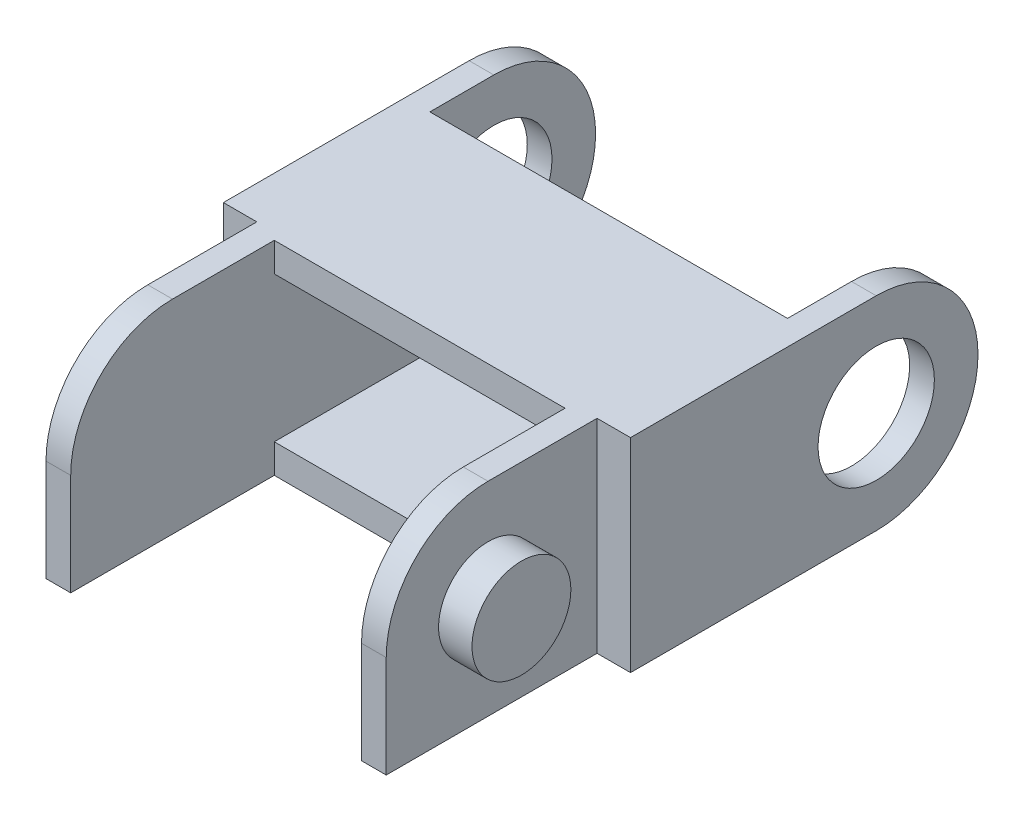
ISO-10303-21;
HEADER;
FILE_DESCRIPTION(('STEP AP214'),'2;1');
FILE_NAME('part.step','',(''),(''),'','','');
FILE_SCHEMA(('AUTOMOTIVE_DESIGN { 1 0 10303 214 1 1 1 1 }'));
ENDSEC;
DATA;
#1=APPLICATION_CONTEXT('core data for automotive mechanical design processes');
#2=APPLICATION_PROTOCOL_DEFINITION('international standard','automotive_design',2000,#1);
#3=PRODUCT_CONTEXT('',#1,'mechanical');
#4=PRODUCT('Part','Part','',(#3));
#5=PRODUCT_RELATED_PRODUCT_CATEGORY('part','',(#4));
#6=PRODUCT_DEFINITION_FORMATION('','',#4);
#7=PRODUCT_DEFINITION_CONTEXT('part definition',#1,'design');
#8=PRODUCT_DEFINITION('design','',#6,#7);
#9=PRODUCT_DEFINITION_SHAPE('','',#8);
#10=(LENGTH_UNIT() NAMED_UNIT(*) SI_UNIT(.MILLI.,.METRE.));
#11=(NAMED_UNIT(*) PLANE_ANGLE_UNIT() SI_UNIT($,.RADIAN.));
#12=(NAMED_UNIT(*) SI_UNIT($,.STERADIAN.) SOLID_ANGLE_UNIT());
#13=UNCERTAINTY_MEASURE_WITH_UNIT(LENGTH_MEASURE(1.E-05),#10,'distance_accuracy_value','');
#14=(GEOMETRIC_REPRESENTATION_CONTEXT(3) GLOBAL_UNCERTAINTY_ASSIGNED_CONTEXT((#13)) GLOBAL_UNIT_ASSIGNED_CONTEXT((#10,
#11,#12)) REPRESENTATION_CONTEXT('',''));
#15=CARTESIAN_POINT('',(0.,0.,0.));
#16=DIRECTION('',(0.,0.,1.));
#17=DIRECTION('',(1.,0.,0.));
#18=AXIS2_PLACEMENT_3D('',#15,#16,#17);
#19=CARTESIAN_POINT('',(-12.,-7.,5.));
#20=DIRECTION('',(0.,1.,0.));
#21=DIRECTION('',(-1.,0.,0.));
#22=AXIS2_PLACEMENT_3D('',#19,#20,#21);
#23=PLANE('',#22);
#24=DIRECTION('',(-1.,0.,0.));
#25=VECTOR('',#24,1.);
#26=CARTESIAN_POINT('',(25.7089257261219,-7.,4.5));
#27=LINE('',#26,#25);
#28=CARTESIAN_POINT('',(-11.7,-7.,4.5));
#29=VERTEX_POINT('',#28);
#30=CARTESIAN_POINT('',(-14.,-7.,4.5));
#31=VERTEX_POINT('',#30);
#32=EDGE_CURVE('E243',#29,#31,#27,.T.);
#33=ORIENTED_EDGE('',*,*,#32,.T.);
#34=DIRECTION('',(0.,0.,-1.));
#35=VECTOR('',#34,1.);
#36=CARTESIAN_POINT('',(-14.,-7.,5.));
#37=LINE('',#36,#35);
#38=CARTESIAN_POINT('',(-14.,-7.,-12.4));
#39=VERTEX_POINT('',#38);
#40=EDGE_CURVE('E292',#31,#39,#37,.T.);
#41=ORIENTED_EDGE('',*,*,#40,.T.);
#42=DIRECTION('',(1.,0.,0.));
#43=VECTOR('',#42,1.);
#44=CARTESIAN_POINT('',(-14.,-7.,-12.4));
#45=LINE('',#44,#43);
#46=CARTESIAN_POINT('',(-12.3,-7.,-12.4));
#47=VERTEX_POINT('',#46);
#48=EDGE_CURVE('E302',#39,#47,#45,.T.);
#49=ORIENTED_EDGE('',*,*,#48,.T.);
#50=DIRECTION('',(0.,0.,1.));
#51=VECTOR('',#50,1.);
#52=CARTESIAN_POINT('',(-12.3,-7.,-12.4));
#53=LINE('',#52,#51);
#54=CARTESIAN_POINT('',(-12.3,-7.,-5.));
#55=VERTEX_POINT('',#54);
#56=EDGE_CURVE('E257',#47,#55,#53,.T.);
#57=ORIENTED_EDGE('',*,*,#56,.T.);
#58=DIRECTION('',(1.,0.,0.));
#59=VECTOR('',#58,1.);
#60=CARTESIAN_POINT('',(-12.,-7.,-5.));
#61=LINE('',#60,#59);
#62=CARTESIAN_POINT('',(12.3,-7.,-5.));
#63=VERTEX_POINT('',#62);
#64=EDGE_CURVE('E468',#55,#63,#61,.T.);
#65=ORIENTED_EDGE('',*,*,#64,.T.);
#66=DIRECTION('',(0.,0.,1.));
#67=VECTOR('',#66,1.);
#68=CARTESIAN_POINT('',(12.3,-7.,-12.4));
#69=LINE('',#68,#67);
#70=CARTESIAN_POINT('',(12.3,-7.,-12.4));
#71=VERTEX_POINT('',#70);
#72=EDGE_CURVE('E355',#71,#63,#69,.T.);
#73=ORIENTED_EDGE('',*,*,#72,.F.);
#74=DIRECTION('',(-1.,0.,0.));
#75=VECTOR('',#74,1.);
#76=CARTESIAN_POINT('',(14.,-7.,-12.4));
#77=LINE('',#76,#75);
#78=CARTESIAN_POINT('',(14.,-7.,-12.4));
#79=VERTEX_POINT('',#78);
#80=EDGE_CURVE('E397',#79,#71,#77,.T.);
#81=ORIENTED_EDGE('',*,*,#80,.F.);
#82=DIRECTION('',(0.,0.,-1.));
#83=VECTOR('',#82,1.);
#84=CARTESIAN_POINT('',(14.,-7.,5.));
#85=LINE('',#84,#83);
#86=CARTESIAN_POINT('',(14.,-7.,4.5));
#87=VERTEX_POINT('',#86);
#88=EDGE_CURVE('E394',#87,#79,#85,.T.);
#89=ORIENTED_EDGE('',*,*,#88,.F.);
#90=DIRECTION('',(1.,0.,0.));
#91=VECTOR('',#90,1.);
#92=CARTESIAN_POINT('',(-2.3089257261219,-7.,4.5));
#93=LINE('',#92,#91);
#94=CARTESIAN_POINT('',(11.7,-7.,4.5));
#95=VERTEX_POINT('',#94);
#96=EDGE_CURVE('E343',#95,#87,#93,.T.);
#97=ORIENTED_EDGE('',*,*,#96,.F.);
#98=DIRECTION('',(0.,0.,-1.));
#99=VECTOR('',#98,1.);
#100=CARTESIAN_POINT('',(11.7,-7.,19.));
#101=LINE('',#100,#99);
#102=CARTESIAN_POINT('',(11.7,-7.,19.));
#103=VERTEX_POINT('',#102);
#104=EDGE_CURVE('E366',#103,#95,#101,.T.);
#105=ORIENTED_EDGE('',*,*,#104,.F.);
#106=DIRECTION('',(1.,0.,0.));
#107=VECTOR('',#106,1.);
#108=CARTESIAN_POINT('',(10.,-7.,19.));
#109=LINE('',#108,#107);
#110=CARTESIAN_POINT('',(10.,-7.,19.));
#111=VERTEX_POINT('',#110);
#112=EDGE_CURVE('E425',#111,#103,#109,.T.);
#113=ORIENTED_EDGE('',*,*,#112,.F.);
#114=DIRECTION('',(0.,0.,-1.));
#115=VECTOR('',#114,1.);
#116=CARTESIAN_POINT('',(10.,-7.,5.));
#117=LINE('',#116,#115);
#118=CARTESIAN_POINT('',(10.,-7.,5.));
#119=VERTEX_POINT('',#118);
#120=EDGE_CURVE('E404',#111,#119,#117,.T.);
#121=ORIENTED_EDGE('',*,*,#120,.T.);
#122=DIRECTION('',(1.,0.,0.));
#123=VECTOR('',#122,1.);
#124=CARTESIAN_POINT('',(-12.,-7.,5.));
#125=LINE('',#124,#123);
#126=CARTESIAN_POINT('',(-10.,-7.,5.));
#127=VERTEX_POINT('',#126);
#128=EDGE_CURVE('E469',#127,#119,#125,.T.);
#129=ORIENTED_EDGE('',*,*,#128,.F.);
#130=DIRECTION('',(0.,0.,-1.));
#131=VECTOR('',#130,1.);
#132=CARTESIAN_POINT('',(-10.,-7.,5.));
#133=LINE('',#132,#131);
#134=CARTESIAN_POINT('',(-10.,-7.,19.));
#135=VERTEX_POINT('',#134);
#136=EDGE_CURVE('E306',#135,#127,#133,.T.);
#137=ORIENTED_EDGE('',*,*,#136,.F.);
#138=DIRECTION('',(-1.,0.,0.));
#139=VECTOR('',#138,1.);
#140=CARTESIAN_POINT('',(-10.,-7.,19.));
#141=LINE('',#140,#139);
#142=CARTESIAN_POINT('',(-11.7,-7.,19.));
#143=VERTEX_POINT('',#142);
#144=EDGE_CURVE('E322',#135,#143,#141,.T.);
#145=ORIENTED_EDGE('',*,*,#144,.T.);
#146=DIRECTION('',(0.,0.,-1.));
#147=VECTOR('',#146,1.);
#148=CARTESIAN_POINT('',(-11.7,-7.,19.));
#149=LINE('',#148,#147);
#150=EDGE_CURVE('E265',#143,#29,#149,.T.);
#151=ORIENTED_EDGE('',*,*,#150,.T.);
#152=EDGE_LOOP('',(#33,#41,#49,#57,#65,#73,#81,#89,#97,#105,#113,#121,#129,#137,#145,#151));
#153=FACE_BOUND('',#152,.T.);
#154=ADVANCED_FACE('F39',(#153),#23,.F.);
#155=CARTESIAN_POINT('',(-12.,7.,5.));
#156=DIRECTION('',(0.,-1.,0.));
#157=DIRECTION('',(0.,0.,-1.));
#158=AXIS2_PLACEMENT_3D('',#155,#156,#157);
#159=PLANE('',#158);
#160=DIRECTION('',(0.,0.,-1.));
#161=VECTOR('',#160,1.);
#162=CARTESIAN_POINT('',(12.3,7.,-5.));
#163=LINE('',#162,#161);
#164=CARTESIAN_POINT('',(12.3,7.,-8.));
#165=VERTEX_POINT('',#164);
#166=CARTESIAN_POINT('',(12.3,7.,-12.4));
#167=VERTEX_POINT('',#166);
#168=EDGE_CURVE('E230',#165,#167,#163,.T.);
#169=ORIENTED_EDGE('',*,*,#168,.F.);
#170=DIRECTION('',(-1.,0.,0.));
#171=VECTOR('',#170,1.);
#172=CARTESIAN_POINT('',(-12.3,7.,-8.));
#173=LINE('',#172,#171);
#174=CARTESIAN_POINT('',(-12.3,7.,-8.));
#175=VERTEX_POINT('',#174);
#176=EDGE_CURVE('E207',#165,#175,#173,.T.);
#177=ORIENTED_EDGE('',*,*,#176,.T.);
#178=DIRECTION('',(0.,0.,-1.));
#179=VECTOR('',#178,1.);
#180=CARTESIAN_POINT('',(-12.3,7.,-5.));
#181=LINE('',#180,#179);
#182=CARTESIAN_POINT('',(-12.3,7.,-12.4));
#183=VERTEX_POINT('',#182);
#184=EDGE_CURVE('E217',#175,#183,#181,.T.);
#185=ORIENTED_EDGE('',*,*,#184,.T.);
#186=DIRECTION('',(1.,0.,0.));
#187=VECTOR('',#186,1.);
#188=CARTESIAN_POINT('',(-14.,7.,-12.4));
#189=LINE('',#188,#187);
#190=CARTESIAN_POINT('',(-14.,7.,-12.4));
#191=VERTEX_POINT('',#190);
#192=EDGE_CURVE('E299',#191,#183,#189,.T.);
#193=ORIENTED_EDGE('',*,*,#192,.F.);
#194=DIRECTION('',(0.,0.,1.));
#195=VECTOR('',#194,1.);
#196=CARTESIAN_POINT('',(-14.,7.,-12.4));
#197=LINE('',#196,#195);
#198=CARTESIAN_POINT('',(-14.,7.,4.5));
#199=VERTEX_POINT('',#198);
#200=EDGE_CURVE('E295',#191,#199,#197,.T.);
#201=ORIENTED_EDGE('',*,*,#200,.T.);
#202=DIRECTION('',(-1.,0.,0.));
#203=VECTOR('',#202,1.);
#204=CARTESIAN_POINT('',(25.7089257261219,7.,4.5));
#205=LINE('',#204,#203);
#206=CARTESIAN_POINT('',(-11.7,7.,4.5));
#207=VERTEX_POINT('',#206);
#208=EDGE_CURVE('E236',#207,#199,#205,.T.);
#209=ORIENTED_EDGE('',*,*,#208,.F.);
#210=DIRECTION('',(0.,0.,1.));
#211=VECTOR('',#210,1.);
#212=CARTESIAN_POINT('',(-11.7,7.,5.));
#213=LINE('',#212,#211);
#214=CARTESIAN_POINT('',(-11.7,7.,12.));
#215=VERTEX_POINT('',#214);
#216=EDGE_CURVE('E276',#207,#215,#213,.T.);
#217=ORIENTED_EDGE('',*,*,#216,.T.);
#218=DIRECTION('',(-1.,0.,0.));
#219=VECTOR('',#218,1.);
#220=CARTESIAN_POINT('',(-10.,7.,12.));
#221=LINE('',#220,#219);
#222=CARTESIAN_POINT('',(-10.,7.,12.));
#223=VERTEX_POINT('',#222);
#224=EDGE_CURVE('E323',#223,#215,#221,.T.);
#225=ORIENTED_EDGE('',*,*,#224,.F.);
#226=DIRECTION('',(0.,0.,1.));
#227=VECTOR('',#226,1.);
#228=CARTESIAN_POINT('',(-10.,7.,12.));
#229=LINE('',#228,#227);
#230=CARTESIAN_POINT('',(-10.,7.,5.));
#231=VERTEX_POINT('',#230);
#232=EDGE_CURVE('E315',#231,#223,#229,.T.);
#233=ORIENTED_EDGE('',*,*,#232,.F.);
#234=DIRECTION('',(-1.,0.,0.));
#235=VECTOR('',#234,1.);
#236=CARTESIAN_POINT('',(-12.,7.,5.));
#237=LINE('',#236,#235);
#238=CARTESIAN_POINT('',(10.,7.,5.));
#239=VERTEX_POINT('',#238);
#240=EDGE_CURVE('E472',#239,#231,#237,.T.);
#241=ORIENTED_EDGE('',*,*,#240,.F.);
#242=DIRECTION('',(0.,0.,1.));
#243=VECTOR('',#242,1.);
#244=CARTESIAN_POINT('',(10.,7.,12.));
#245=LINE('',#244,#243);
#246=CARTESIAN_POINT('',(10.,7.,12.));
#247=VERTEX_POINT('',#246);
#248=EDGE_CURVE('E411',#239,#247,#245,.T.);
#249=ORIENTED_EDGE('',*,*,#248,.T.);
#250=DIRECTION('',(1.,0.,0.));
#251=VECTOR('',#250,1.);
#252=CARTESIAN_POINT('',(10.,7.,12.));
#253=LINE('',#252,#251);
#254=CARTESIAN_POINT('',(11.7,7.,12.));
#255=VERTEX_POINT('',#254);
#256=EDGE_CURVE('E424',#247,#255,#253,.T.);
#257=ORIENTED_EDGE('',*,*,#256,.T.);
#258=DIRECTION('',(0.,0.,1.));
#259=VECTOR('',#258,1.);
#260=CARTESIAN_POINT('',(11.7,7.,5.));
#261=LINE('',#260,#259);
#262=CARTESIAN_POINT('',(11.7,7.,4.5));
#263=VERTEX_POINT('',#262);
#264=EDGE_CURVE('E369',#263,#255,#261,.T.);
#265=ORIENTED_EDGE('',*,*,#264,.F.);
#266=DIRECTION('',(1.,0.,0.));
#267=VECTOR('',#266,1.);
#268=CARTESIAN_POINT('',(-2.3089257261219,7.,4.5));
#269=LINE('',#268,#267);
#270=CARTESIAN_POINT('',(14.,7.,4.5));
#271=VERTEX_POINT('',#270);
#272=EDGE_CURVE('E340',#263,#271,#269,.T.);
#273=ORIENTED_EDGE('',*,*,#272,.T.);
#274=DIRECTION('',(0.,0.,1.));
#275=VECTOR('',#274,1.);
#276=CARTESIAN_POINT('',(14.,7.,-12.4));
#277=LINE('',#276,#275);
#278=CARTESIAN_POINT('',(14.,7.,-12.4));
#279=VERTEX_POINT('',#278);
#280=EDGE_CURVE('E390',#279,#271,#277,.T.);
#281=ORIENTED_EDGE('',*,*,#280,.F.);
#282=DIRECTION('',(-1.,0.,0.));
#283=VECTOR('',#282,1.);
#284=CARTESIAN_POINT('',(14.,7.,-12.4));
#285=LINE('',#284,#283);
#286=EDGE_CURVE('E401',#279,#167,#285,.T.);
#287=ORIENTED_EDGE('',*,*,#286,.T.);
#288=EDGE_LOOP('',(#169,#177,#185,#193,#201,#209,#217,#225,#233,#241,#249,#257,#265,#273,#281,#287));
#289=FACE_BOUND('',#288,.T.);
#290=ADVANCED_FACE('F228',(#289),#159,.F.);
#291=CARTESIAN_POINT('',(-14.,0.,-12.4));
#292=DIRECTION('',(-1.,0.,0.));
#293=DIRECTION('',(0.,0.,-1.));
#294=AXIS2_PLACEMENT_3D('',#291,#292,#293);
#295=PLANE('',#294);
#296=CARTESIAN_POINT('',(-14.,0.,-12.4));
#297=DIRECTION('',(1.,0.,0.));
#298=DIRECTION('',(0.,0.,-1.));
#299=AXIS2_PLACEMENT_3D('',#296,#297,#298);
#300=CIRCLE('',#299,4.);
#301=CARTESIAN_POINT('',(-14.,0.,-16.4));
#302=VERTEX_POINT('',#301);
#303=EDGE_CURVE('E284',#302,#302,#300,.T.);
#304=ORIENTED_EDGE('',*,*,#303,.T.);
#305=EDGE_LOOP('',(#304));
#306=FACE_BOUND('',#305,.T.);
#307=ORIENTED_EDGE('',*,*,#40,.F.);
#308=DIRECTION('',(0.,1.,0.));
#309=VECTOR('',#308,1.);
#310=CARTESIAN_POINT('',(-14.,7.,4.5));
#311=LINE('',#310,#309);
#312=EDGE_CURVE('E232',#31,#199,#311,.T.);
#313=ORIENTED_EDGE('',*,*,#312,.T.);
#314=ORIENTED_EDGE('',*,*,#200,.F.);
#315=CARTESIAN_POINT('',(-14.,0.,-12.4));
#316=DIRECTION('',(1.,0.,0.));
#317=DIRECTION('',(0.,0.,-1.));
#318=AXIS2_PLACEMENT_3D('',#315,#316,#317);
#319=CIRCLE('',#318,7.);
#320=EDGE_CURVE('E288',#39,#191,#319,.T.);
#321=ORIENTED_EDGE('',*,*,#320,.F.);
#322=EDGE_LOOP('',(#307,#313,#314,#321));
#323=FACE_BOUND('',#322,.T.);
#324=ADVANCED_FACE('F514',(#306,#323),#295,.T.);
#325=CARTESIAN_POINT('',(-14.,0.,-12.4));
#326=DIRECTION('',(1.,0.,0.));
#327=DIRECTION('',(0.,0.,-1.));
#328=AXIS2_PLACEMENT_3D('',#325,#326,#327);
#329=CYLINDRICAL_SURFACE('',#328,7.);
#330=ORIENTED_EDGE('',*,*,#192,.T.);
#331=CARTESIAN_POINT('',(-12.3,0.,-12.4));
#332=DIRECTION('',(-1.,0.,0.));
#333=DIRECTION('',(0.,0.,1.));
#334=AXIS2_PLACEMENT_3D('',#331,#332,#333);
#335=CIRCLE('',#334,7.);
#336=EDGE_CURVE('E221',#183,#47,#335,.T.);
#337=ORIENTED_EDGE('',*,*,#336,.T.);
#338=ORIENTED_EDGE('',*,*,#48,.F.);
#339=ORIENTED_EDGE('',*,*,#320,.T.);
#340=EDGE_LOOP('',(#330,#337,#338,#339));
#341=FACE_BOUND('',#340,.T.);
#342=ADVANCED_FACE('F509',(#341),#329,.T.);
#343=CARTESIAN_POINT('',(-14.,0.,-12.4));
#344=DIRECTION('',(1.,0.,0.));
#345=DIRECTION('',(0.,0.,-1.));
#346=AXIS2_PLACEMENT_3D('',#343,#344,#345);
#347=CYLINDRICAL_SURFACE('',#346,4.);
#348=ORIENTED_EDGE('',*,*,#303,.F.);
#349=EDGE_LOOP('',(#348));
#350=FACE_BOUND('',#349,.T.);
#351=CARTESIAN_POINT('',(-12.3,0.,-12.4));
#352=DIRECTION('',(-1.,0.,0.));
#353=DIRECTION('',(0.,0.,1.));
#354=AXIS2_PLACEMENT_3D('',#351,#352,#353);
#355=CIRCLE('',#354,4.);
#356=CARTESIAN_POINT('',(-12.3,0.,-8.4));
#357=VERTEX_POINT('',#356);
#358=EDGE_CURVE('E242',#357,#357,#355,.T.);
#359=ORIENTED_EDGE('',*,*,#358,.F.);
#360=EDGE_LOOP('',(#359));
#361=FACE_BOUND('',#360,.T.);
#362=ADVANCED_FACE('F750',(#350,#361),#347,.F.);
#363=CARTESIAN_POINT('',(-10.,0.,12.));
#364=DIRECTION('',(-1.,0.,0.));
#365=DIRECTION('',(0.,0.,1.));
#366=AXIS2_PLACEMENT_3D('',#363,#364,#365);
#367=CYLINDRICAL_SURFACE('',#366,7.);
#368=CARTESIAN_POINT('',(-11.7,0.,12.));
#369=DIRECTION('',(1.,0.,0.));
#370=DIRECTION('',(0.,0.,-1.));
#371=AXIS2_PLACEMENT_3D('',#368,#369,#370);
#372=CIRCLE('',#371,7.);
#373=CARTESIAN_POINT('',(-11.7,0.,19.));
#374=VERTEX_POINT('',#373);
#375=EDGE_CURVE('E272',#215,#374,#372,.T.);
#376=ORIENTED_EDGE('',*,*,#375,.T.);
#377=DIRECTION('',(-1.,0.,0.));
#378=VECTOR('',#377,1.);
#379=CARTESIAN_POINT('',(-10.,0.,19.));
#380=LINE('',#379,#378);
#381=CARTESIAN_POINT('',(-10.,0.,19.));
#382=VERTEX_POINT('',#381);
#383=EDGE_CURVE('E328',#382,#374,#380,.T.);
#384=ORIENTED_EDGE('',*,*,#383,.F.);
#385=CARTESIAN_POINT('',(-10.,0.,12.));
#386=DIRECTION('',(1.,0.,0.));
#387=DIRECTION('',(0.,0.,1.));
#388=AXIS2_PLACEMENT_3D('',#385,#386,#387);
#389=CIRCLE('',#388,7.);
#390=EDGE_CURVE('E312',#223,#382,#389,.T.);
#391=ORIENTED_EDGE('',*,*,#390,.F.);
#392=ORIENTED_EDGE('',*,*,#224,.T.);
#393=EDGE_LOOP('',(#376,#384,#391,#392));
#394=FACE_BOUND('',#393,.T.);
#395=ADVANCED_FACE('F526',(#394),#367,.T.);
#396=CARTESIAN_POINT('',(-10.,-7.,19.));
#397=DIRECTION('',(0.,0.,-1.));
#398=DIRECTION('',(-1.,0.,0.));
#399=AXIS2_PLACEMENT_3D('',#396,#397,#398);
#400=PLANE('',#399);
#401=DIRECTION('',(0.,-1.,0.));
#402=VECTOR('',#401,1.);
#403=CARTESIAN_POINT('',(-11.7,0.,19.));
#404=LINE('',#403,#402);
#405=EDGE_CURVE('E268',#374,#143,#404,.T.);
#406=ORIENTED_EDGE('',*,*,#405,.T.);
#407=ORIENTED_EDGE('',*,*,#144,.F.);
#408=DIRECTION('',(0.,-1.,0.));
#409=VECTOR('',#408,1.);
#410=CARTESIAN_POINT('',(-10.,-7.,19.));
#411=LINE('',#410,#409);
#412=EDGE_CURVE('E309',#382,#135,#411,.T.);
#413=ORIENTED_EDGE('',*,*,#412,.F.);
#414=ORIENTED_EDGE('',*,*,#383,.T.);
#415=EDGE_LOOP('',(#406,#407,#413,#414));
#416=FACE_BOUND('',#415,.T.);
#417=ADVANCED_FACE('F530',(#416),#400,.F.);
#418=CARTESIAN_POINT('',(0.,0.,5.));
#419=DIRECTION('',(0.,0.,-1.));
#420=DIRECTION('',(-1.,0.,0.));
#421=AXIS2_PLACEMENT_3D('',#418,#419,#420);
#422=PLANE('',#421);
#423=ORIENTED_EDGE('',*,*,#240,.T.);
#424=DIRECTION('',(0.,1.,0.));
#425=VECTOR('',#424,1.);
#426=CARTESIAN_POINT('',(-10.,-7.,5.));
#427=LINE('',#426,#425);
#428=CARTESIAN_POINT('',(-10.,5.,5.));
#429=VERTEX_POINT('',#428);
#430=EDGE_CURVE('E318',#429,#231,#427,.T.);
#431=ORIENTED_EDGE('',*,*,#430,.F.);
#432=DIRECTION('',(-1.,0.,0.));
#433=VECTOR('',#432,1.);
#434=CARTESIAN_POINT('',(-9.99999999999999,5.,5.));
#435=LINE('',#434,#433);
#436=CARTESIAN_POINT('',(10.,5.,5.));
#437=VERTEX_POINT('',#436);
#438=EDGE_CURVE('E436',#437,#429,#435,.T.);
#439=ORIENTED_EDGE('',*,*,#438,.F.);
#440=DIRECTION('',(0.,1.,0.));
#441=VECTOR('',#440,1.);
#442=CARTESIAN_POINT('',(10.,-7.,5.));
#443=LINE('',#442,#441);
#444=EDGE_CURVE('E412',#437,#239,#443,.T.);
#445=ORIENTED_EDGE('',*,*,#444,.T.);
#446=EDGE_LOOP('',(#423,#431,#439,#445));
#447=FACE_BOUND('',#446,.T.);
#448=ADVANCED_FACE('F541',(#447),#422,.F.);
#449=CARTESIAN_POINT('',(14.,0.,-12.4));
#450=DIRECTION('',(-1.,0.,0.));
#451=DIRECTION('',(0.,0.,1.));
#452=AXIS2_PLACEMENT_3D('',#449,#450,#451);
#453=CYLINDRICAL_SURFACE('',#452,7.);
#454=CARTESIAN_POINT('',(12.3,0.,-12.4));
#455=DIRECTION('',(-1.,0.,0.));
#456=DIRECTION('',(0.,0.,1.));
#457=AXIS2_PLACEMENT_3D('',#454,#455,#456);
#458=CIRCLE('',#457,7.);
#459=EDGE_CURVE('E352',#167,#71,#458,.T.);
#460=ORIENTED_EDGE('',*,*,#459,.F.);
#461=ORIENTED_EDGE('',*,*,#286,.F.);
#462=CARTESIAN_POINT('',(14.,0.,-12.4));
#463=DIRECTION('',(1.,0.,0.));
#464=DIRECTION('',(0.,0.,-1.));
#465=AXIS2_PLACEMENT_3D('',#462,#463,#464);
#466=CIRCLE('',#465,7.);
#467=EDGE_CURVE('E386',#79,#279,#466,.T.);
#468=ORIENTED_EDGE('',*,*,#467,.F.);
#469=ORIENTED_EDGE('',*,*,#80,.T.);
#470=EDGE_LOOP('',(#460,#461,#468,#469));
#471=FACE_BOUND('',#470,.T.);
#472=ADVANCED_FACE('F496',(#471),#453,.T.);
#473=CARTESIAN_POINT('',(14.,0.,-12.4));
#474=DIRECTION('',(-1.,0.,0.));
#475=DIRECTION('',(0.,0.,1.));
#476=AXIS2_PLACEMENT_3D('',#473,#474,#475);
#477=CYLINDRICAL_SURFACE('',#476,4.);
#478=CARTESIAN_POINT('',(14.,0.,-12.4));
#479=DIRECTION('',(1.,0.,0.));
#480=DIRECTION('',(0.,0.,-1.));
#481=AXIS2_PLACEMENT_3D('',#478,#479,#480);
#482=CIRCLE('',#481,4.);
#483=CARTESIAN_POINT('',(14.,0.,-16.4));
#484=VERTEX_POINT('',#483);
#485=EDGE_CURVE('E382',#484,#484,#482,.T.);
#486=ORIENTED_EDGE('',*,*,#485,.T.);
#487=EDGE_LOOP('',(#486));
#488=FACE_BOUND('',#487,.T.);
#489=CARTESIAN_POINT('',(12.3,0.,-12.4));
#490=DIRECTION('',(-1.,0.,0.));
#491=DIRECTION('',(0.,0.,1.));
#492=AXIS2_PLACEMENT_3D('',#489,#490,#491);
#493=CIRCLE('',#492,4.);
#494=CARTESIAN_POINT('',(12.3,0.,-8.4));
#495=VERTEX_POINT('',#494);
#496=EDGE_CURVE('E339',#495,#495,#493,.T.);
#497=ORIENTED_EDGE('',*,*,#496,.T.);
#498=EDGE_LOOP('',(#497));
#499=FACE_BOUND('',#498,.T.);
#500=ADVANCED_FACE('F609',(#488,#499),#477,.F.);
#501=CARTESIAN_POINT('',(10.,-7.,19.));
#502=DIRECTION('',(0.,0.,1.));
#503=DIRECTION('',(1.,0.,0.));
#504=AXIS2_PLACEMENT_3D('',#501,#502,#503);
#505=PLANE('',#504);
#506=ORIENTED_EDGE('',*,*,#112,.T.);
#507=DIRECTION('',(0.,-1.,0.));
#508=VECTOR('',#507,1.);
#509=CARTESIAN_POINT('',(11.7,0.,19.));
#510=LINE('',#509,#508);
#511=CARTESIAN_POINT('',(11.7,0.,19.));
#512=VERTEX_POINT('',#511);
#513=EDGE_CURVE('E375',#512,#103,#510,.T.);
#514=ORIENTED_EDGE('',*,*,#513,.F.);
#515=DIRECTION('',(1.,0.,0.));
#516=VECTOR('',#515,1.);
#517=CARTESIAN_POINT('',(10.,0.,19.));
#518=LINE('',#517,#516);
#519=CARTESIAN_POINT('',(10.,0.,19.));
#520=VERTEX_POINT('',#519);
#521=EDGE_CURVE('E429',#520,#512,#518,.T.);
#522=ORIENTED_EDGE('',*,*,#521,.F.);
#523=DIRECTION('',(0.,-1.,0.));
#524=VECTOR('',#523,1.);
#525=CARTESIAN_POINT('',(10.,-7.,19.));
#526=LINE('',#525,#524);
#527=EDGE_CURVE('E420',#520,#111,#526,.T.);
#528=ORIENTED_EDGE('',*,*,#527,.T.);
#529=EDGE_LOOP('',(#506,#514,#522,#528));
#530=FACE_BOUND('',#529,.T.);
#531=ADVANCED_FACE('F567',(#530),#505,.T.);
#532=CARTESIAN_POINT('',(10.,0.,12.));
#533=DIRECTION('',(1.,0.,0.));
#534=DIRECTION('',(0.,0.,-1.));
#535=AXIS2_PLACEMENT_3D('',#532,#533,#534);
#536=CYLINDRICAL_SURFACE('',#535,7.);
#537=ORIENTED_EDGE('',*,*,#521,.T.);
#538=CARTESIAN_POINT('',(11.7,0.,12.));
#539=DIRECTION('',(1.,0.,0.));
#540=DIRECTION('',(0.,0.,-1.));
#541=AXIS2_PLACEMENT_3D('',#538,#539,#540);
#542=CIRCLE('',#541,7.);
#543=EDGE_CURVE('E372',#255,#512,#542,.T.);
#544=ORIENTED_EDGE('',*,*,#543,.F.);
#545=ORIENTED_EDGE('',*,*,#256,.F.);
#546=CARTESIAN_POINT('',(10.,0.,12.));
#547=DIRECTION('',(1.,0.,0.));
#548=DIRECTION('',(0.,0.,1.));
#549=AXIS2_PLACEMENT_3D('',#546,#547,#548);
#550=CIRCLE('',#549,7.);
#551=EDGE_CURVE('E416',#247,#520,#550,.T.);
#552=ORIENTED_EDGE('',*,*,#551,.T.);
#553=EDGE_LOOP('',(#537,#544,#545,#552));
#554=FACE_BOUND('',#553,.T.);
#555=ADVANCED_FACE('F571',(#554),#536,.T.);
#556=DIRECTION('',(1.,0.,0.));
#557=VECTOR('',#556,1.);
#558=CARTESIAN_POINT('',(-9.99999999999999,-5.,5.));
#559=LINE('',#558,#557);
#560=CARTESIAN_POINT('',(-9.99999999999999,-5.,5.));
#561=VERTEX_POINT('',#560);
#562=CARTESIAN_POINT('',(10.,-5.,5.));
#563=VERTEX_POINT('',#562);
#564=EDGE_CURVE('E440',#561,#563,#559,.T.);
#565=ORIENTED_EDGE('',*,*,#564,.F.);
#566=EDGE_CURVE('E319',#127,#561,#427,.T.);
#567=ORIENTED_EDGE('',*,*,#566,.F.);
#568=ORIENTED_EDGE('',*,*,#128,.T.);
#569=EDGE_CURVE('E408',#119,#563,#443,.T.);
#570=ORIENTED_EDGE('',*,*,#569,.T.);
#571=EDGE_LOOP('',(#565,#567,#568,#570));
#572=FACE_BOUND('',#571,.T.);
#573=ADVANCED_FACE('F560',(#572),#422,.F.);
#574=CARTESIAN_POINT('',(0.,0.,-5.));
#575=DIRECTION('',(0.,0.,-1.));
#576=DIRECTION('',(-1.,0.,0.));
#577=AXIS2_PLACEMENT_3D('',#574,#575,#576);
#578=PLANE('',#577);
#579=DIRECTION('',(0.,1.,0.));
#580=VECTOR('',#579,1.);
#581=CARTESIAN_POINT('',(10.,-5.,-5.));
#582=LINE('',#581,#580);
#583=CARTESIAN_POINT('',(10.,-5.,-5.));
#584=VERTEX_POINT('',#583);
#585=CARTESIAN_POINT('',(10.,5.10102051443365,-5.));
#586=VERTEX_POINT('',#585);
#587=EDGE_CURVE('E61',#584,#586,#582,.T.);
#588=ORIENTED_EDGE('',*,*,#587,.T.);
#589=DIRECTION('',(-1.,0.,0.));
#590=VECTOR('',#589,1.);
#591=CARTESIAN_POINT('',(10.,5.10102051443364,-5.));
#592=LINE('',#591,#590);
#593=CARTESIAN_POINT('',(12.3,5.10102051443364,-5.));
#594=VERTEX_POINT('',#593);
#595=EDGE_CURVE('E48',#586,#594,#592,.F.);
#596=ORIENTED_EDGE('',*,*,#595,.T.);
#597=DIRECTION('',(0.,1.,0.));
#598=VECTOR('',#597,1.);
#599=CARTESIAN_POINT('',(12.3,-7.,-5.));
#600=LINE('',#599,#598);
#601=EDGE_CURVE('E54',#63,#594,#600,.T.);
#602=ORIENTED_EDGE('',*,*,#601,.F.);
#603=ORIENTED_EDGE('',*,*,#64,.F.);
#604=DIRECTION('',(0.,1.,0.));
#605=VECTOR('',#604,1.);
#606=CARTESIAN_POINT('',(-12.3,-7.,-5.));
#607=LINE('',#606,#605);
#608=CARTESIAN_POINT('',(-12.3,5.10102051443364,-5.));
#609=VERTEX_POINT('',#608);
#610=EDGE_CURVE('E225',#55,#609,#607,.T.);
#611=ORIENTED_EDGE('',*,*,#610,.T.);
#612=DIRECTION('',(-1.,0.,0.));
#613=VECTOR('',#612,1.);
#614=CARTESIAN_POINT('',(-12.3,5.10102051443364,-5.));
#615=LINE('',#614,#613);
#616=CARTESIAN_POINT('',(-9.99999999999999,5.10102051443365,-5.));
#617=VERTEX_POINT('',#616);
#618=EDGE_CURVE('E210',#609,#617,#615,.F.);
#619=ORIENTED_EDGE('',*,*,#618,.T.);
#620=DIRECTION('',(0.,-1.,0.));
#621=VECTOR('',#620,1.);
#622=CARTESIAN_POINT('',(-9.99999999999999,-5.,-5.));
#623=LINE('',#622,#621);
#624=CARTESIAN_POINT('',(-9.99999999999999,-5.,-5.));
#625=VERTEX_POINT('',#624);
#626=EDGE_CURVE('E448',#617,#625,#623,.T.);
#627=ORIENTED_EDGE('',*,*,#626,.T.);
#628=DIRECTION('',(1.,0.,0.));
#629=VECTOR('',#628,1.);
#630=CARTESIAN_POINT('',(-9.99999999999999,-5.,-5.));
#631=LINE('',#630,#629);
#632=EDGE_CURVE('E441',#625,#584,#631,.T.);
#633=ORIENTED_EDGE('',*,*,#632,.T.);
#634=EDGE_LOOP('',(#588,#596,#602,#603,#611,#619,#627,#633));
#635=FACE_BOUND('',#634,.T.);
#636=ADVANCED_FACE('F489',(#635),#578,.T.);
#637=CARTESIAN_POINT('',(10.,-5.,5.));
#638=DIRECTION('',(-1.,0.,0.));
#639=DIRECTION('',(0.,0.,1.));
#640=AXIS2_PLACEMENT_3D('',#637,#638,#639);
#641=PLANE('',#640);
#642=ORIENTED_EDGE('',*,*,#587,.F.);
#643=DIRECTION('',(0.,0.,-1.));
#644=VECTOR('',#643,1.);
#645=CARTESIAN_POINT('',(10.,-5.,5.));
#646=LINE('',#645,#644);
#647=EDGE_CURVE('E445',#563,#584,#646,.T.);
#648=ORIENTED_EDGE('',*,*,#647,.F.);
#649=ORIENTED_EDGE('',*,*,#569,.F.);
#650=ORIENTED_EDGE('',*,*,#120,.F.);
#651=ORIENTED_EDGE('',*,*,#527,.F.);
#652=ORIENTED_EDGE('',*,*,#551,.F.);
#653=ORIENTED_EDGE('',*,*,#248,.F.);
#654=ORIENTED_EDGE('',*,*,#444,.F.);
#655=DIRECTION('',(0.,0.,-1.));
#656=VECTOR('',#655,1.);
#657=CARTESIAN_POINT('',(10.,5.,5.));
#658=LINE('',#657,#656);
#659=CARTESIAN_POINT('',(10.,5.,-4.));
#660=VERTEX_POINT('',#659);
#661=EDGE_CURVE('E464',#437,#660,#658,.T.);
#662=ORIENTED_EDGE('',*,*,#661,.T.);
#663=CARTESIAN_POINT('',(10.,10.,-4.));
#664=DIRECTION('',(-1.,0.,0.));
#665=DIRECTION('',(0.,0.,1.));
#666=AXIS2_PLACEMENT_3D('',#663,#664,#665);
#667=CIRCLE('',#666,5.);
#668=EDGE_CURVE('E485',#660,#586,#667,.F.);
#669=ORIENTED_EDGE('',*,*,#668,.T.);
#670=EDGE_LOOP('',(#642,#648,#649,#650,#651,#652,#653,#654,#662,#669));
#671=FACE_BOUND('',#670,.T.);
#672=ADVANCED_FACE('F547',(#671),#641,.T.);
#673=CARTESIAN_POINT('',(-9.99999999999999,5.,5.));
#674=DIRECTION('',(0.,-1.,0.));
#675=DIRECTION('',(0.,0.,-1.));
#676=AXIS2_PLACEMENT_3D('',#673,#674,#675);
#677=PLANE('',#676);
#678=DIRECTION('',(0.,0.,-1.));
#679=VECTOR('',#678,1.);
#680=CARTESIAN_POINT('',(-9.99999999999999,5.,5.));
#681=LINE('',#680,#679);
#682=CARTESIAN_POINT('',(-9.99999999999999,5.,-4.));
#683=VERTEX_POINT('',#682);
#684=EDGE_CURVE('E460',#429,#683,#681,.T.);
#685=ORIENTED_EDGE('',*,*,#684,.T.);
#686=DIRECTION('',(1.,0.,0.));
#687=VECTOR('',#686,1.);
#688=CARTESIAN_POINT('',(12.3,5.,-4.));
#689=LINE('',#688,#687);
#690=EDGE_CURVE('E214',#683,#660,#689,.T.);
#691=ORIENTED_EDGE('',*,*,#690,.T.);
#692=ORIENTED_EDGE('',*,*,#661,.F.);
#693=ORIENTED_EDGE('',*,*,#438,.T.);
#694=EDGE_LOOP('',(#685,#691,#692,#693));
#695=FACE_BOUND('',#694,.T.);
#696=ADVANCED_FACE('F550',(#695),#677,.T.);
#697=CARTESIAN_POINT('',(-9.99999999999999,-5.,5.));
#698=DIRECTION('',(1.,0.,0.));
#699=DIRECTION('',(0.,0.,-1.));
#700=AXIS2_PLACEMENT_3D('',#697,#698,#699);
#701=PLANE('',#700);
#702=ORIENTED_EDGE('',*,*,#626,.F.);
#703=CARTESIAN_POINT('',(-9.99999999999999,10.,-4.));
#704=DIRECTION('',(1.,0.,0.));
#705=DIRECTION('',(0.,0.,-1.));
#706=AXIS2_PLACEMENT_3D('',#703,#704,#705);
#707=CIRCLE('',#706,5.);
#708=EDGE_CURVE('E482',#617,#683,#707,.F.);
#709=ORIENTED_EDGE('',*,*,#708,.T.);
#710=ORIENTED_EDGE('',*,*,#684,.F.);
#711=ORIENTED_EDGE('',*,*,#430,.T.);
#712=ORIENTED_EDGE('',*,*,#232,.T.);
#713=ORIENTED_EDGE('',*,*,#390,.T.);
#714=ORIENTED_EDGE('',*,*,#412,.T.);
#715=ORIENTED_EDGE('',*,*,#136,.T.);
#716=ORIENTED_EDGE('',*,*,#566,.T.);
#717=DIRECTION('',(0.,0.,-1.));
#718=VECTOR('',#717,1.);
#719=CARTESIAN_POINT('',(-9.99999999999999,-5.,5.));
#720=LINE('',#719,#718);
#721=EDGE_CURVE('E457',#561,#625,#720,.T.);
#722=ORIENTED_EDGE('',*,*,#721,.T.);
#723=EDGE_LOOP('',(#702,#709,#710,#711,#712,#713,#714,#715,#716,#722));
#724=FACE_BOUND('',#723,.T.);
#725=ADVANCED_FACE('F534',(#724),#701,.T.);
#726=CARTESIAN_POINT('',(-9.99999999999999,-5.,5.));
#727=DIRECTION('',(0.,1.,0.));
#728=DIRECTION('',(0.,0.,1.));
#729=AXIS2_PLACEMENT_3D('',#726,#727,#728);
#730=PLANE('',#729);
#731=ORIENTED_EDGE('',*,*,#632,.F.);
#732=ORIENTED_EDGE('',*,*,#721,.F.);
#733=ORIENTED_EDGE('',*,*,#564,.T.);
#734=ORIENTED_EDGE('',*,*,#647,.T.);
#735=EDGE_LOOP('',(#731,#732,#733,#734));
#736=FACE_BOUND('',#735,.T.);
#737=ADVANCED_FACE('F556',(#736),#730,.T.);
#738=CARTESIAN_POINT('',(14.,0.,-12.4));
#739=DIRECTION('',(1.,0.,0.));
#740=DIRECTION('',(0.,0.,-1.));
#741=AXIS2_PLACEMENT_3D('',#738,#739,#740);
#742=PLANE('',#741);
#743=DIRECTION('',(0.,1.,0.));
#744=VECTOR('',#743,1.);
#745=CARTESIAN_POINT('',(14.,7.,4.5));
#746=LINE('',#745,#744);
#747=EDGE_CURVE('E327',#87,#271,#746,.T.);
#748=ORIENTED_EDGE('',*,*,#747,.F.);
#749=ORIENTED_EDGE('',*,*,#88,.T.);
#750=ORIENTED_EDGE('',*,*,#467,.T.);
#751=ORIENTED_EDGE('',*,*,#280,.T.);
#752=EDGE_LOOP('',(#748,#749,#750,#751));
#753=FACE_BOUND('',#752,.T.);
#754=ORIENTED_EDGE('',*,*,#485,.F.);
#755=EDGE_LOOP('',(#754));
#756=FACE_BOUND('',#755,.T.);
#757=ADVANCED_FACE('F502',(#753,#756),#742,.T.);
#758=CARTESIAN_POINT('',(11.7,0.,12.));
#759=DIRECTION('',(1.,0.,0.));
#760=DIRECTION('',(0.,0.,-1.));
#761=AXIS2_PLACEMENT_3D('',#758,#759,#760);
#762=PLANE('',#761);
#763=CARTESIAN_POINT('',(11.7,0.,12.));
#764=DIRECTION('',(1.,0.,0.));
#765=DIRECTION('',(0.,0.,-1.));
#766=AXIS2_PLACEMENT_3D('',#763,#764,#765);
#767=CIRCLE('',#766,3.4);
#768=CARTESIAN_POINT('',(11.7,0.,8.6));
#769=VERTEX_POINT('',#768);
#770=EDGE_CURVE('E362',#769,#769,#767,.T.);
#771=ORIENTED_EDGE('',*,*,#770,.F.);
#772=EDGE_LOOP('',(#771));
#773=FACE_BOUND('',#772,.T.);
#774=ORIENTED_EDGE('',*,*,#104,.T.);
#775=DIRECTION('',(0.,-1.,0.));
#776=VECTOR('',#775,1.);
#777=CARTESIAN_POINT('',(11.7,7.,4.5));
#778=LINE('',#777,#776);
#779=EDGE_CURVE('E335',#263,#95,#778,.T.);
#780=ORIENTED_EDGE('',*,*,#779,.F.);
#781=ORIENTED_EDGE('',*,*,#264,.T.);
#782=ORIENTED_EDGE('',*,*,#543,.T.);
#783=ORIENTED_EDGE('',*,*,#513,.T.);
#784=EDGE_LOOP('',(#774,#780,#781,#782,#783));
#785=FACE_BOUND('',#784,.T.);
#786=ADVANCED_FACE('F573',(#773,#785),#762,.T.);
#787=CARTESIAN_POINT('',(14.,0.,12.));
#788=DIRECTION('',(1.,0.,0.));
#789=DIRECTION('',(0.,0.,-1.));
#790=AXIS2_PLACEMENT_3D('',#787,#788,#789);
#791=PLANE('',#790);
#792=CARTESIAN_POINT('',(14.,0.,12.));
#793=DIRECTION('',(1.,0.,0.));
#794=DIRECTION('',(0.,0.,-1.));
#795=AXIS2_PLACEMENT_3D('',#792,#793,#794);
#796=CIRCLE('',#795,3.4);
#797=CARTESIAN_POINT('',(14.,0.,8.6));
#798=VERTEX_POINT('',#797);
#799=EDGE_CURVE('E378',#798,#798,#796,.T.);
#800=ORIENTED_EDGE('',*,*,#799,.T.);
#801=EDGE_LOOP('',(#800));
#802=FACE_BOUND('',#801,.T.);
#803=ADVANCED_FACE('F619',(#802),#791,.T.);
#804=CARTESIAN_POINT('',(14.,0.,12.));
#805=DIRECTION('',(-1.,0.,0.));
#806=DIRECTION('',(0.,0.,1.));
#807=AXIS2_PLACEMENT_3D('',#804,#805,#806);
#808=CYLINDRICAL_SURFACE('',#807,3.4);
#809=ORIENTED_EDGE('',*,*,#799,.F.);
#810=EDGE_LOOP('',(#809));
#811=FACE_BOUND('',#810,.T.);
#812=ORIENTED_EDGE('',*,*,#770,.T.);
#813=EDGE_LOOP('',(#812));
#814=FACE_BOUND('',#813,.T.);
#815=ADVANCED_FACE('F584',(#811,#814),#808,.T.);
#816=CARTESIAN_POINT('',(12.3,0.,-12.4));
#817=DIRECTION('',(-1.,0.,0.));
#818=DIRECTION('',(0.,0.,1.));
#819=AXIS2_PLACEMENT_3D('',#816,#817,#818);
#820=PLANE('',#819);
#821=ORIENTED_EDGE('',*,*,#601,.T.);
#822=CARTESIAN_POINT('',(12.3,10.,-4.));
#823=DIRECTION('',(-1.,0.,0.));
#824=DIRECTION('',(0.,0.,1.));
#825=AXIS2_PLACEMENT_3D('',#822,#823,#824);
#826=CIRCLE('',#825,5.);
#827=EDGE_CURVE('E11',#594,#165,#826,.F.);
#828=ORIENTED_EDGE('',*,*,#827,.T.);
#829=ORIENTED_EDGE('',*,*,#168,.T.);
#830=ORIENTED_EDGE('',*,*,#459,.T.);
#831=ORIENTED_EDGE('',*,*,#72,.T.);
#832=EDGE_LOOP('',(#821,#828,#829,#830,#831));
#833=FACE_BOUND('',#832,.T.);
#834=ORIENTED_EDGE('',*,*,#496,.F.);
#835=EDGE_LOOP('',(#834));
#836=FACE_BOUND('',#835,.T.);
#837=ADVANCED_FACE('F490',(#833,#836),#820,.T.);
#838=CARTESIAN_POINT('',(-2.3089257261219,7.,4.5));
#839=DIRECTION('',(0.,0.,-1.));
#840=DIRECTION('',(0.,1.,0.));
#841=AXIS2_PLACEMENT_3D('',#838,#839,#840);
#842=PLANE('',#841);
#843=ORIENTED_EDGE('',*,*,#779,.T.);
#844=ORIENTED_EDGE('',*,*,#96,.T.);
#845=ORIENTED_EDGE('',*,*,#747,.T.);
#846=ORIENTED_EDGE('',*,*,#272,.F.);
#847=EDGE_LOOP('',(#843,#844,#845,#846));
#848=FACE_BOUND('',#847,.T.);
#849=ADVANCED_FACE('F575',(#848),#842,.F.);
#850=CARTESIAN_POINT('',(-11.7,0.,12.));
#851=DIRECTION('',(-1.,0.,0.));
#852=DIRECTION('',(0.,0.,-1.));
#853=AXIS2_PLACEMENT_3D('',#850,#851,#852);
#854=PLANE('',#853);
#855=ORIENTED_EDGE('',*,*,#150,.F.);
#856=ORIENTED_EDGE('',*,*,#405,.F.);
#857=ORIENTED_EDGE('',*,*,#375,.F.);
#858=ORIENTED_EDGE('',*,*,#216,.F.);
#859=DIRECTION('',(0.,-1.,0.));
#860=VECTOR('',#859,1.);
#861=CARTESIAN_POINT('',(-11.7,7.,4.5));
#862=LINE('',#861,#860);
#863=EDGE_CURVE('E239',#207,#29,#862,.T.);
#864=ORIENTED_EDGE('',*,*,#863,.T.);
#865=EDGE_LOOP('',(#855,#856,#857,#858,#864));
#866=FACE_BOUND('',#865,.T.);
#867=CARTESIAN_POINT('',(-11.7,0.,12.));
#868=DIRECTION('',(1.,0.,0.));
#869=DIRECTION('',(0.,0.,-1.));
#870=AXIS2_PLACEMENT_3D('',#867,#868,#869);
#871=CIRCLE('',#870,3.4);
#872=CARTESIAN_POINT('',(-11.7,0.,8.6));
#873=VERTEX_POINT('',#872);
#874=EDGE_CURVE('E261',#873,#873,#871,.T.);
#875=ORIENTED_EDGE('',*,*,#874,.T.);
#876=EDGE_LOOP('',(#875));
#877=FACE_BOUND('',#876,.T.);
#878=ADVANCED_FACE('F522',(#866,#877),#854,.T.);
#879=CARTESIAN_POINT('',(-14.,0.,12.));
#880=DIRECTION('',(-1.,0.,0.));
#881=DIRECTION('',(0.,0.,-1.));
#882=AXIS2_PLACEMENT_3D('',#879,#880,#881);
#883=PLANE('',#882);
#884=CARTESIAN_POINT('',(-14.,0.,12.));
#885=DIRECTION('',(1.,0.,0.));
#886=DIRECTION('',(0.,0.,-1.));
#887=AXIS2_PLACEMENT_3D('',#884,#885,#886);
#888=CIRCLE('',#887,3.4);
#889=CARTESIAN_POINT('',(-14.,0.,8.6));
#890=VERTEX_POINT('',#889);
#891=EDGE_CURVE('E280',#890,#890,#888,.T.);
#892=ORIENTED_EDGE('',*,*,#891,.F.);
#893=EDGE_LOOP('',(#892));
#894=FACE_BOUND('',#893,.T.);
#895=ADVANCED_FACE('F582',(#894),#883,.T.);
#896=CARTESIAN_POINT('',(-14.,0.,12.));
#897=DIRECTION('',(1.,0.,0.));
#898=DIRECTION('',(0.,0.,-1.));
#899=AXIS2_PLACEMENT_3D('',#896,#897,#898);
#900=CYLINDRICAL_SURFACE('',#899,3.4);
#901=ORIENTED_EDGE('',*,*,#891,.T.);
#902=EDGE_LOOP('',(#901));
#903=FACE_BOUND('',#902,.T.);
#904=ORIENTED_EDGE('',*,*,#874,.F.);
#905=EDGE_LOOP('',(#904));
#906=FACE_BOUND('',#905,.T.);
#907=ADVANCED_FACE('F661',(#903,#906),#900,.T.);
#908=CARTESIAN_POINT('',(-12.3,0.,-12.4));
#909=DIRECTION('',(1.,0.,0.));
#910=DIRECTION('',(0.,0.,1.));
#911=AXIS2_PLACEMENT_3D('',#908,#909,#910);
#912=PLANE('',#911);
#913=ORIENTED_EDGE('',*,*,#184,.F.);
#914=CARTESIAN_POINT('',(-12.3,10.,-4.));
#915=DIRECTION('',(1.,0.,0.));
#916=DIRECTION('',(0.,0.,-1.));
#917=AXIS2_PLACEMENT_3D('',#914,#915,#916);
#918=CIRCLE('',#917,5.);
#919=EDGE_CURVE('E202',#175,#609,#918,.F.);
#920=ORIENTED_EDGE('',*,*,#919,.T.);
#921=ORIENTED_EDGE('',*,*,#610,.F.);
#922=ORIENTED_EDGE('',*,*,#56,.F.);
#923=ORIENTED_EDGE('',*,*,#336,.F.);
#924=EDGE_LOOP('',(#913,#920,#921,#922,#923));
#925=FACE_BOUND('',#924,.T.);
#926=ORIENTED_EDGE('',*,*,#358,.T.);
#927=EDGE_LOOP('',(#926));
#928=FACE_BOUND('',#927,.T.);
#929=ADVANCED_FACE('F218',(#925,#928),#912,.T.);
#930=CARTESIAN_POINT('',(25.7089257261219,7.,4.5));
#931=DIRECTION('',(0.,0.,1.));
#932=DIRECTION('',(0.,-1.,0.));
#933=AXIS2_PLACEMENT_3D('',#930,#931,#932);
#934=PLANE('',#933);
#935=ORIENTED_EDGE('',*,*,#208,.T.);
#936=ORIENTED_EDGE('',*,*,#312,.F.);
#937=ORIENTED_EDGE('',*,*,#32,.F.);
#938=ORIENTED_EDGE('',*,*,#863,.F.);
#939=EDGE_LOOP('',(#935,#936,#937,#938));
#940=FACE_BOUND('',#939,.T.);
#941=ADVANCED_FACE('F520',(#940),#934,.T.);
#942=CARTESIAN_POINT('',(-12.3,10.,-4.));
#943=DIRECTION('',(-1.,0.,0.));
#944=DIRECTION('',(0.,0.,1.));
#945=AXIS2_PLACEMENT_3D('',#942,#943,#944);
#946=CYLINDRICAL_SURFACE('',#945,5.);
#947=ORIENTED_EDGE('',*,*,#668,.F.);
#948=ORIENTED_EDGE('',*,*,#690,.F.);
#949=ORIENTED_EDGE('',*,*,#708,.F.);
#950=ORIENTED_EDGE('',*,*,#618,.F.);
#951=ORIENTED_EDGE('',*,*,#919,.F.);
#952=ORIENTED_EDGE('',*,*,#176,.F.);
#953=ORIENTED_EDGE('',*,*,#827,.F.);
#954=ORIENTED_EDGE('',*,*,#595,.F.);
#955=EDGE_LOOP('',(#947,#948,#949,#950,#951,#952,#953,#954));
#956=FACE_BOUND('',#955,.T.);
#957=ADVANCED_FACE('F41',(#956),#946,.T.);
#958=CLOSED_SHELL('',(#154,#290,#324,#342,#362,#395,#417,#448,#472,#500,#531,#555,#573,#636,
#672,#696,#725,#737,#757,#786,#803,#815,#837,#849,#878,#895,#907,#929,#941,#957));
#959=MANIFOLD_SOLID_BREP('B2',#958);
#960=ADVANCED_BREP_SHAPE_REPRESENTATION('',(#18,#959),#14);
#961=SHAPE_DEFINITION_REPRESENTATION(#9,#960);
ENDSEC;
END-ISO-10303-21;
